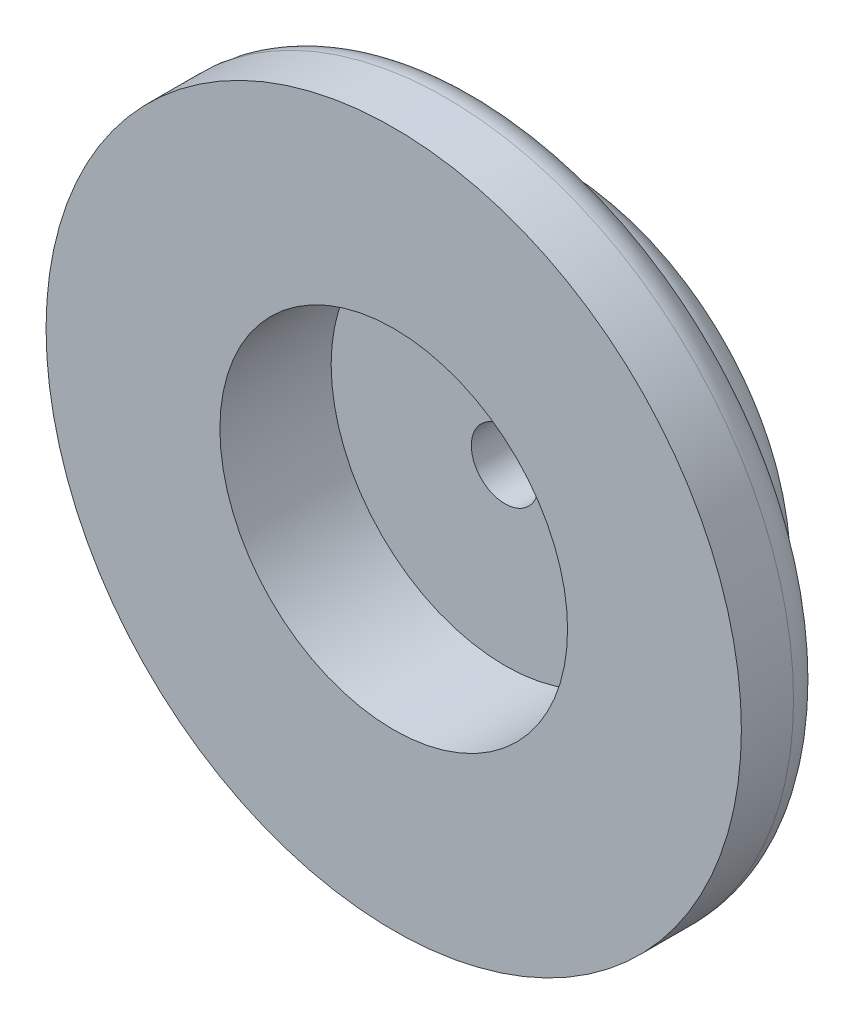
ISO-10303-21;
HEADER;
FILE_DESCRIPTION(('STEP AP214'),'2;1');
FILE_NAME('part.step','',(''),(''),'','','');
FILE_SCHEMA(('AUTOMOTIVE_DESIGN { 1 0 10303 214 1 1 1 1 }'));
ENDSEC;
DATA;
#1=APPLICATION_CONTEXT('core data for automotive mechanical design processes');
#2=APPLICATION_PROTOCOL_DEFINITION('international standard','automotive_design',2000,#1);
#3=PRODUCT_CONTEXT('',#1,'mechanical');
#4=PRODUCT('Part','Part','',(#3));
#5=PRODUCT_RELATED_PRODUCT_CATEGORY('part','',(#4));
#6=PRODUCT_DEFINITION_FORMATION('','',#4);
#7=PRODUCT_DEFINITION_CONTEXT('part definition',#1,'design');
#8=PRODUCT_DEFINITION('design','',#6,#7);
#9=PRODUCT_DEFINITION_SHAPE('','',#8);
#10=(LENGTH_UNIT() NAMED_UNIT(*) SI_UNIT(.MILLI.,.METRE.));
#11=(NAMED_UNIT(*) PLANE_ANGLE_UNIT() SI_UNIT($,.RADIAN.));
#12=(NAMED_UNIT(*) SI_UNIT($,.STERADIAN.) SOLID_ANGLE_UNIT());
#13=UNCERTAINTY_MEASURE_WITH_UNIT(LENGTH_MEASURE(1.E-05),#10,'distance_accuracy_value','');
#14=(GEOMETRIC_REPRESENTATION_CONTEXT(3) GLOBAL_UNCERTAINTY_ASSIGNED_CONTEXT((#13)) GLOBAL_UNIT_ASSIGNED_CONTEXT((#10,
#11,#12)) REPRESENTATION_CONTEXT('',''));
#15=CARTESIAN_POINT('',(0.,0.,0.));
#16=DIRECTION('',(0.,0.,1.));
#17=DIRECTION('',(1.,0.,0.));
#18=AXIS2_PLACEMENT_3D('',#15,#16,#17);
#19=CARTESIAN_POINT('',(0.,0.,0.));
#20=DIRECTION('',(0.,0.,1.));
#21=DIRECTION('',(1.,0.,0.));
#22=AXIS2_PLACEMENT_3D('',#19,#20,#21);
#23=CYLINDRICAL_SURFACE('',#22,12.7);
#24=CARTESIAN_POINT('',(0.,0.,-87.376));
#25=DIRECTION('',(0.,0.,1.));
#26=DIRECTION('',(1.,0.,0.));
#27=AXIS2_PLACEMENT_3D('',#24,#25,#26);
#28=CIRCLE('',#27,12.7);
#29=CARTESIAN_POINT('',(12.7,0.,-87.376));
#30=VERTEX_POINT('',#29);
#31=EDGE_CURVE('E62',#30,#30,#28,.T.);
#32=ORIENTED_EDGE('',*,*,#31,.F.);
#33=EDGE_LOOP('',(#32));
#34=FACE_BOUND('',#33,.T.);
#35=CARTESIAN_POINT('',(0.,0.,-79.248));
#36=DIRECTION('',(0.,0.,1.));
#37=DIRECTION('',(1.,0.,0.));
#38=AXIS2_PLACEMENT_3D('',#35,#36,#37);
#39=CIRCLE('',#38,12.7);
#40=CARTESIAN_POINT('',(12.7,0.,-79.248));
#41=VERTEX_POINT('',#40);
#42=EDGE_CURVE('E56',#41,#41,#39,.T.);
#43=ORIENTED_EDGE('',*,*,#42,.T.);
#44=EDGE_LOOP('',(#43));
#45=FACE_BOUND('',#44,.T.);
#46=ADVANCED_FACE('F30',(#34,#45),#23,.F.);
#47=CARTESIAN_POINT('',(0.,12.7,-79.248));
#48=DIRECTION('',(0.,0.,-1.));
#49=DIRECTION('',(-1.,0.,0.));
#50=AXIS2_PLACEMENT_3D('',#47,#48,#49);
#51=PLANE('',#50);
#52=ORIENTED_EDGE('',*,*,#42,.F.);
#53=EDGE_LOOP('',(#52));
#54=FACE_BOUND('',#53,.T.);
#55=CARTESIAN_POINT('',(0.,0.,-79.248));
#56=DIRECTION('',(0.,0.,1.));
#57=DIRECTION('',(1.,0.,0.));
#58=AXIS2_PLACEMENT_3D('',#55,#56,#57);
#59=CIRCLE('',#58,25.4);
#60=CARTESIAN_POINT('',(25.4,0.,-79.248));
#61=VERTEX_POINT('',#60);
#62=EDGE_CURVE('E59',#61,#61,#59,.T.);
#63=ORIENTED_EDGE('',*,*,#62,.T.);
#64=EDGE_LOOP('',(#63));
#65=FACE_BOUND('',#64,.T.);
#66=ADVANCED_FACE('F105',(#54,#65),#51,.F.);
#67=CARTESIAN_POINT('',(0.,0.,0.));
#68=DIRECTION('',(0.,0.,1.));
#69=DIRECTION('',(1.,0.,0.));
#70=AXIS2_PLACEMENT_3D('',#67,#68,#69);
#71=CYLINDRICAL_SURFACE('',#70,25.4);
#72=CARTESIAN_POINT('',(0.,0.,-83.058));
#73=DIRECTION('',(0.,0.,1.));
#74=DIRECTION('',(1.,0.,0.));
#75=AXIS2_PLACEMENT_3D('',#72,#73,#74);
#76=CIRCLE('',#75,25.4);
#77=CARTESIAN_POINT('',(25.4,0.,-83.058));
#78=VERTEX_POINT('',#77);
#79=EDGE_CURVE('E41',#78,#78,#76,.T.);
#80=ORIENTED_EDGE('',*,*,#79,.T.);
#81=EDGE_LOOP('',(#80));
#82=FACE_BOUND('',#81,.T.);
#83=ORIENTED_EDGE('',*,*,#62,.F.);
#84=EDGE_LOOP('',(#83));
#85=FACE_BOUND('',#84,.T.);
#86=ADVANCED_FACE('F111',(#82,#85),#71,.T.);
#87=CARTESIAN_POINT('',(0.,25.4,-85.598));
#88=DIRECTION('',(0.,0.,1.));
#89=DIRECTION('',(1.,0.,0.));
#90=AXIS2_PLACEMENT_3D('',#87,#88,#89);
#91=PLANE('',#90);
#92=CARTESIAN_POINT('',(0.,0.,-85.598));
#93=DIRECTION('',(0.,0.,1.));
#94=DIRECTION('',(1.,0.,0.));
#95=AXIS2_PLACEMENT_3D('',#92,#93,#94);
#96=CIRCLE('',#95,22.86);
#97=CARTESIAN_POINT('',(22.86,0.,-85.598));
#98=VERTEX_POINT('',#97);
#99=EDGE_CURVE('E10',#98,#98,#96,.F.);
#100=ORIENTED_EDGE('',*,*,#99,.T.);
#101=EDGE_LOOP('',(#100));
#102=FACE_BOUND('',#101,.T.);
#103=CARTESIAN_POINT('',(0.,0.,-85.598));
#104=DIRECTION('',(0.,0.,1.));
#105=DIRECTION('',(1.,0.,0.));
#106=AXIS2_PLACEMENT_3D('',#103,#104,#105);
#107=CIRCLE('',#106,20.32);
#108=CARTESIAN_POINT('',(20.32,0.,-85.598));
#109=VERTEX_POINT('',#108);
#110=EDGE_CURVE('E37',#109,#109,#107,.T.);
#111=ORIENTED_EDGE('',*,*,#110,.T.);
#112=EDGE_LOOP('',(#111));
#113=FACE_BOUND('',#112,.T.);
#114=ADVANCED_FACE('F92',(#102,#113),#91,.F.);
#115=CARTESIAN_POINT('',(0.,0.,0.));
#116=DIRECTION('',(0.,0.,1.));
#117=DIRECTION('',(1.,0.,0.));
#118=AXIS2_PLACEMENT_3D('',#115,#116,#117);
#119=CYLINDRICAL_SURFACE('',#118,17.78);
#120=CARTESIAN_POINT('',(0.,0.,-89.408));
#121=DIRECTION('',(0.,0.,1.));
#122=DIRECTION('',(1.,0.,0.));
#123=AXIS2_PLACEMENT_3D('',#120,#121,#122);
#124=CIRCLE('',#123,17.78);
#125=CARTESIAN_POINT('',(17.78,0.,-89.408));
#126=VERTEX_POINT('',#125);
#127=EDGE_CURVE('E50',#126,#126,#124,.T.);
#128=ORIENTED_EDGE('',*,*,#127,.T.);
#129=EDGE_LOOP('',(#128));
#130=FACE_BOUND('',#129,.T.);
#131=CARTESIAN_POINT('',(0.,0.,-88.138));
#132=DIRECTION('',(0.,0.,1.));
#133=DIRECTION('',(1.,0.,0.));
#134=AXIS2_PLACEMENT_3D('',#131,#132,#133);
#135=CIRCLE('',#134,17.78);
#136=CARTESIAN_POINT('',(17.78,0.,-88.138));
#137=VERTEX_POINT('',#136);
#138=EDGE_CURVE('E53',#137,#137,#135,.F.);
#139=ORIENTED_EDGE('',*,*,#138,.T.);
#140=EDGE_LOOP('',(#139));
#141=FACE_BOUND('',#140,.T.);
#142=ADVANCED_FACE('F79',(#130,#141),#119,.T.);
#143=CARTESIAN_POINT('',(0.,0.,-91.948));
#144=DIRECTION('',(0.,0.,1.));
#145=DIRECTION('',(1.,0.,0.));
#146=AXIS2_PLACEMENT_3D('',#143,#144,#145);
#147=PLANE('',#146);
#148=CARTESIAN_POINT('',(0.,0.,-91.948));
#149=DIRECTION('',(0.,0.,-1.));
#150=DIRECTION('',(-1.,0.,0.));
#151=AXIS2_PLACEMENT_3D('',#148,#149,#150);
#152=CIRCLE('',#151,2.45744999999999);
#153=CARTESIAN_POINT('',(-2.45744999999999,0.,-91.948));
#154=VERTEX_POINT('',#153);
#155=EDGE_CURVE('E68',#154,#154,#152,.T.);
#156=ORIENTED_EDGE('',*,*,#155,.F.);
#157=EDGE_LOOP('',(#156));
#158=FACE_BOUND('',#157,.T.);
#159=CARTESIAN_POINT('',(0.,0.,-91.948));
#160=DIRECTION('',(0.,0.,1.));
#161=DIRECTION('',(1.,0.,0.));
#162=AXIS2_PLACEMENT_3D('',#159,#160,#161);
#163=CIRCLE('',#162,15.24);
#164=CARTESIAN_POINT('',(15.24,0.,-91.948));
#165=VERTEX_POINT('',#164);
#166=EDGE_CURVE('E45',#165,#165,#163,.F.);
#167=ORIENTED_EDGE('',*,*,#166,.T.);
#168=EDGE_LOOP('',(#167));
#169=FACE_BOUND('',#168,.T.);
#170=ADVANCED_FACE('F75',(#158,#169),#147,.F.);
#171=CARTESIAN_POINT('',(0.,12.7,-87.376));
#172=DIRECTION('',(0.,0.,-1.));
#173=DIRECTION('',(-1.,0.,0.));
#174=AXIS2_PLACEMENT_3D('',#171,#172,#173);
#175=PLANE('',#174);
#176=CARTESIAN_POINT('',(0.,0.,-87.376));
#177=DIRECTION('',(0.,0.,-1.));
#178=DIRECTION('',(-1.,0.,0.));
#179=AXIS2_PLACEMENT_3D('',#176,#177,#178);
#180=CIRCLE('',#179,2.45744999999999);
#181=CARTESIAN_POINT('',(-2.45744999999999,0.,-87.376));
#182=VERTEX_POINT('',#181);
#183=EDGE_CURVE('E65',#182,#182,#180,.T.);
#184=ORIENTED_EDGE('',*,*,#183,.T.);
#185=EDGE_LOOP('',(#184));
#186=FACE_BOUND('',#185,.T.);
#187=ORIENTED_EDGE('',*,*,#31,.T.);
#188=EDGE_LOOP('',(#187));
#189=FACE_BOUND('',#188,.T.);
#190=ADVANCED_FACE('F78',(#186,#189),#175,.F.);
#191=CARTESIAN_POINT('',(0.,0.,-89.408));
#192=DIRECTION('',(0.,0.,1.));
#193=DIRECTION('',(1.,0.,0.));
#194=AXIS2_PLACEMENT_3D('',#191,#192,#193);
#195=TOROIDAL_SURFACE('',#194,15.24,2.54);
#196=ORIENTED_EDGE('',*,*,#166,.F.);
#197=EDGE_LOOP('',(#196));
#198=FACE_BOUND('',#197,.T.);
#199=ORIENTED_EDGE('',*,*,#127,.F.);
#200=EDGE_LOOP('',(#199));
#201=FACE_BOUND('',#200,.T.);
#202=ADVANCED_FACE('F83',(#198,#201),#195,.T.);
#203=CARTESIAN_POINT('',(0.,0.,-83.058));
#204=DIRECTION('',(0.,0.,1.));
#205=DIRECTION('',(1.,0.,0.));
#206=AXIS2_PLACEMENT_3D('',#203,#204,#205);
#207=TOROIDAL_SURFACE('',#206,22.86,2.54);
#208=ORIENTED_EDGE('',*,*,#99,.F.);
#209=EDGE_LOOP('',(#208));
#210=FACE_BOUND('',#209,.T.);
#211=ORIENTED_EDGE('',*,*,#79,.F.);
#212=EDGE_LOOP('',(#211));
#213=FACE_BOUND('',#212,.T.);
#214=ADVANCED_FACE('F86',(#210,#213),#207,.T.);
#215=CARTESIAN_POINT('',(0.,0.,-88.138));
#216=DIRECTION('',(0.,0.,1.));
#217=DIRECTION('',(1.,0.,0.));
#218=AXIS2_PLACEMENT_3D('',#215,#216,#217);
#219=TOROIDAL_SURFACE('',#218,20.32,2.54);
#220=ORIENTED_EDGE('',*,*,#138,.F.);
#221=EDGE_LOOP('',(#220));
#222=FACE_BOUND('',#221,.T.);
#223=ORIENTED_EDGE('',*,*,#110,.F.);
#224=EDGE_LOOP('',(#223));
#225=FACE_BOUND('',#224,.T.);
#226=ADVANCED_FACE('F32',(#222,#225),#219,.F.);
#227=CARTESIAN_POINT('',(0.,0.,-91.948));
#228=DIRECTION('',(0.,0.,-1.));
#229=DIRECTION('',(-1.,0.,0.));
#230=AXIS2_PLACEMENT_3D('',#227,#228,#229);
#231=CYLINDRICAL_SURFACE('',#230,2.45744999999999);
#232=ORIENTED_EDGE('',*,*,#155,.T.);
#233=EDGE_LOOP('',(#232));
#234=FACE_BOUND('',#233,.T.);
#235=ORIENTED_EDGE('',*,*,#183,.F.);
#236=EDGE_LOOP('',(#235));
#237=FACE_BOUND('',#236,.T.);
#238=ADVANCED_FACE('F72',(#234,#237),#231,.F.);
#239=CLOSED_SHELL('',(#46,#66,#86,#114,#142,#170,#190,#202,#214,#226,#238));
#240=MANIFOLD_SOLID_BREP('B2',#239);
#241=ADVANCED_BREP_SHAPE_REPRESENTATION('',(#18,#240),#14);
#242=SHAPE_DEFINITION_REPRESENTATION(#9,#241);
ENDSEC;
END-ISO-10303-21;
